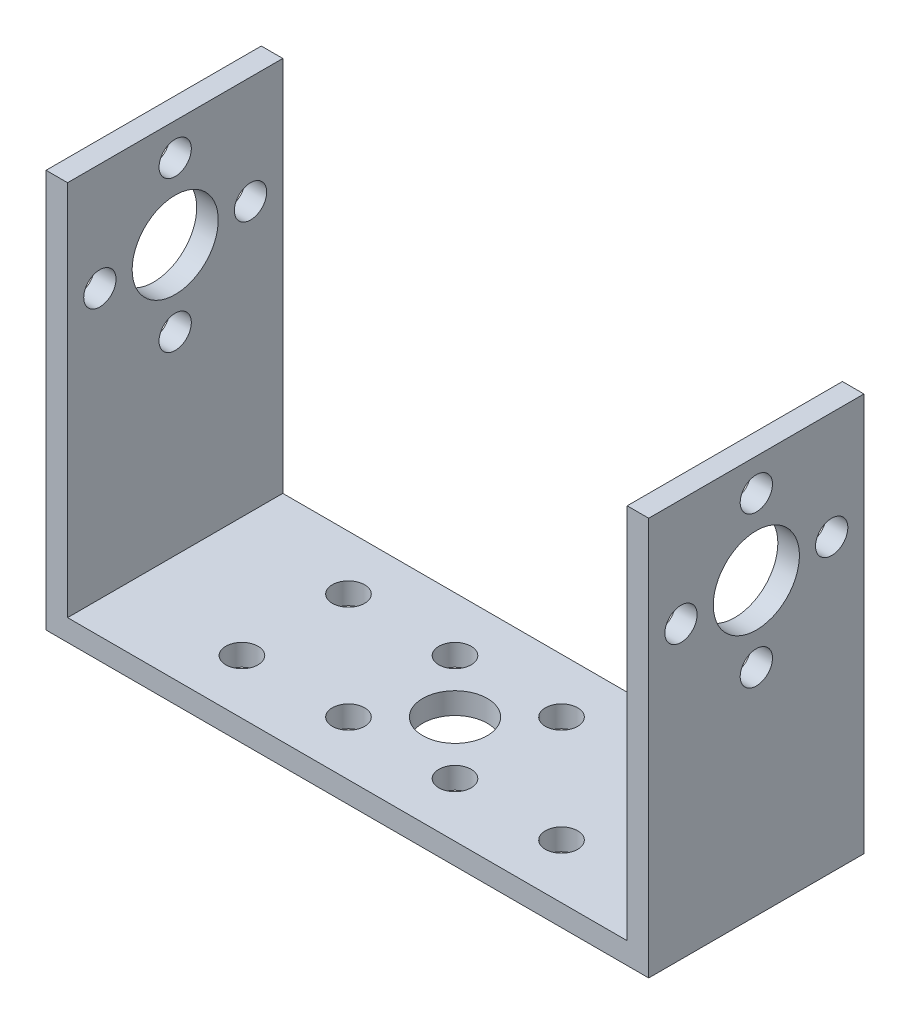
ISO-10303-21;
HEADER;
FILE_DESCRIPTION(('STEP AP214'),'2;1');
FILE_NAME('part.step','',(''),(''),'','','');
FILE_SCHEMA(('AUTOMOTIVE_DESIGN { 1 0 10303 214 1 1 1 1 }'));
ENDSEC;
DATA;
#1=APPLICATION_CONTEXT('core data for automotive mechanical design processes');
#2=APPLICATION_PROTOCOL_DEFINITION('international standard','automotive_design',2000,#1);
#3=PRODUCT_CONTEXT('',#1,'mechanical');
#4=PRODUCT('Part','Part','',(#3));
#5=PRODUCT_RELATED_PRODUCT_CATEGORY('part','',(#4));
#6=PRODUCT_DEFINITION_FORMATION('','',#4);
#7=PRODUCT_DEFINITION_CONTEXT('part definition',#1,'design');
#8=PRODUCT_DEFINITION('design','',#6,#7);
#9=PRODUCT_DEFINITION_SHAPE('','',#8);
#10=(LENGTH_UNIT() NAMED_UNIT(*) SI_UNIT(.MILLI.,.METRE.));
#11=(NAMED_UNIT(*) PLANE_ANGLE_UNIT() SI_UNIT($,.RADIAN.));
#12=(NAMED_UNIT(*) SI_UNIT($,.STERADIAN.) SOLID_ANGLE_UNIT());
#13=UNCERTAINTY_MEASURE_WITH_UNIT(LENGTH_MEASURE(1.E-05),#10,'distance_accuracy_value','');
#14=(GEOMETRIC_REPRESENTATION_CONTEXT(3) GLOBAL_UNCERTAINTY_ASSIGNED_CONTEXT((#13)) GLOBAL_UNIT_ASSIGNED_CONTEXT((#10,
#11,#12)) REPRESENTATION_CONTEXT('',''));
#15=CARTESIAN_POINT('',(0.,0.,0.));
#16=DIRECTION('',(0.,0.,1.));
#17=DIRECTION('',(1.,0.,0.));
#18=AXIS2_PLACEMENT_3D('',#15,#16,#17);
#19=CARTESIAN_POINT('',(0.,2.,0.));
#20=DIRECTION('',(0.,-1.,0.));
#21=DIRECTION('',(0.,0.,-1.));
#22=AXIS2_PLACEMENT_3D('',#19,#20,#21);
#23=PLANE('',#22);
#24=CARTESIAN_POINT('',(25.8759689922481,2.,-8.95348837209302));
#25=DIRECTION('',(0.,1.,0.));
#26=DIRECTION('',(0.,0.,1.));
#27=AXIS2_PLACEMENT_3D('',#24,#25,#26);
#28=CIRCLE('',#27,3.);
#29=CARTESIAN_POINT('',(25.8759689922481,2.,-5.95348837209302));
#30=VERTEX_POINT('',#29);
#31=EDGE_CURVE('E242',#30,#30,#28,.T.);
#32=ORIENTED_EDGE('',*,*,#31,.F.);
#33=EDGE_LOOP('',(#32));
#34=FACE_BOUND('',#33,.T.);
#35=CARTESIAN_POINT('',(20.9264689922481,2.,-13.902988372093));
#36=DIRECTION('',(0.,1.,0.));
#37=DIRECTION('',(0.,0.,1.));
#38=AXIS2_PLACEMENT_3D('',#35,#36,#37);
#39=CIRCLE('',#38,1.5);
#40=CARTESIAN_POINT('',(20.9264689922481,2.,-12.402988372093));
#41=VERTEX_POINT('',#40);
#42=EDGE_CURVE('E249',#41,#41,#39,.T.);
#43=ORIENTED_EDGE('',*,*,#42,.F.);
#44=EDGE_LOOP('',(#43));
#45=FACE_BOUND('',#44,.T.);
#46=CARTESIAN_POINT('',(30.8254689922481,2.,-13.902988372093));
#47=DIRECTION('',(0.,1.,0.));
#48=DIRECTION('',(0.,0.,1.));
#49=AXIS2_PLACEMENT_3D('',#46,#47,#48);
#50=CIRCLE('',#49,1.50000000000001);
#51=CARTESIAN_POINT('',(30.8254689922481,2.,-12.402988372093));
#52=VERTEX_POINT('',#51);
#53=EDGE_CURVE('E230',#52,#52,#50,.T.);
#54=ORIENTED_EDGE('',*,*,#53,.F.);
#55=EDGE_LOOP('',(#54));
#56=FACE_BOUND('',#55,.T.);
#57=CARTESIAN_POINT('',(20.9264689922481,2.,-4.00398837209302));
#58=DIRECTION('',(0.,1.,0.));
#59=DIRECTION('',(0.,0.,1.));
#60=AXIS2_PLACEMENT_3D('',#57,#58,#59);
#61=CIRCLE('',#60,1.5);
#62=CARTESIAN_POINT('',(20.9264689922481,2.,-2.50398837209302));
#63=VERTEX_POINT('',#62);
#64=EDGE_CURVE('E237',#63,#63,#61,.T.);
#65=ORIENTED_EDGE('',*,*,#64,.F.);
#66=EDGE_LOOP('',(#65));
#67=FACE_BOUND('',#66,.T.);
#68=CARTESIAN_POINT('',(40.7244689922481,2.,-4.00398837209302));
#69=DIRECTION('',(0.,1.,0.));
#70=DIRECTION('',(0.,0.,1.));
#71=AXIS2_PLACEMENT_3D('',#68,#69,#70);
#72=CIRCLE('',#71,1.5);
#73=CARTESIAN_POINT('',(40.7244689922481,2.,-2.50398837209302));
#74=VERTEX_POINT('',#73);
#75=EDGE_CURVE('E272',#74,#74,#72,.T.);
#76=ORIENTED_EDGE('',*,*,#75,.F.);
#77=EDGE_LOOP('',(#76));
#78=FACE_BOUND('',#77,.T.);
#79=CARTESIAN_POINT('',(40.7244689922481,2.,-13.902988372093));
#80=DIRECTION('',(0.,1.,0.));
#81=DIRECTION('',(0.,0.,1.));
#82=AXIS2_PLACEMENT_3D('',#79,#80,#81);
#83=CIRCLE('',#82,1.5);
#84=CARTESIAN_POINT('',(40.7244689922481,2.,-12.402988372093));
#85=VERTEX_POINT('',#84);
#86=EDGE_CURVE('E266',#85,#85,#83,.T.);
#87=ORIENTED_EDGE('',*,*,#86,.F.);
#88=EDGE_LOOP('',(#87));
#89=FACE_BOUND('',#88,.T.);
#90=CARTESIAN_POINT('',(11.0274689922481,2.,-13.902988372093));
#91=DIRECTION('',(0.,1.,0.));
#92=DIRECTION('',(0.,0.,1.));
#93=AXIS2_PLACEMENT_3D('',#90,#91,#92);
#94=CIRCLE('',#93,1.5);
#95=CARTESIAN_POINT('',(11.0274689922481,2.,-12.402988372093));
#96=VERTEX_POINT('',#95);
#97=EDGE_CURVE('E260',#96,#96,#94,.T.);
#98=ORIENTED_EDGE('',*,*,#97,.F.);
#99=EDGE_LOOP('',(#98));
#100=FACE_BOUND('',#99,.T.);
#101=CARTESIAN_POINT('',(11.0274689922481,2.,-4.00398837209302));
#102=DIRECTION('',(0.,1.,0.));
#103=DIRECTION('',(0.,0.,1.));
#104=AXIS2_PLACEMENT_3D('',#101,#102,#103);
#105=CIRCLE('',#104,1.5);
#106=CARTESIAN_POINT('',(11.0274689922481,2.,-2.50398837209302));
#107=VERTEX_POINT('',#106);
#108=EDGE_CURVE('E254',#107,#107,#105,.T.);
#109=ORIENTED_EDGE('',*,*,#108,.F.);
#110=EDGE_LOOP('',(#109));
#111=FACE_BOUND('',#110,.T.);
#112=CARTESIAN_POINT('',(30.8254689922481,2.,-4.00398837209302));
#113=DIRECTION('',(0.,1.,0.));
#114=DIRECTION('',(0.,0.,1.));
#115=AXIS2_PLACEMENT_3D('',#112,#113,#114);
#116=CIRCLE('',#115,1.50000000000001);
#117=CARTESIAN_POINT('',(30.8254689922481,2.,-2.50398837209302));
#118=VERTEX_POINT('',#117);
#119=EDGE_CURVE('E224',#118,#118,#116,.T.);
#120=ORIENTED_EDGE('',*,*,#119,.F.);
#121=EDGE_LOOP('',(#120));
#122=FACE_BOUND('',#121,.T.);
#123=DIRECTION('',(0.,0.,1.));
#124=VECTOR('',#123,1.);
#125=CARTESIAN_POINT('',(51.8759689922481,2.,-18.953488372093));
#126=LINE('',#125,#124);
#127=CARTESIAN_POINT('',(51.8759689922481,2.,-18.953488372093));
#128=VERTEX_POINT('',#127);
#129=CARTESIAN_POINT('',(51.8759689922481,2.,1.04651162790698));
#130=VERTEX_POINT('',#129);
#131=EDGE_CURVE('E123',#128,#130,#126,.T.);
#132=ORIENTED_EDGE('',*,*,#131,.F.);
#133=DIRECTION('',(-1.,0.,0.));
#134=VECTOR('',#133,1.);
#135=CARTESIAN_POINT('',(-2.12403100775194,2.,-18.953488372093));
#136=LINE('',#135,#134);
#137=CARTESIAN_POINT('',(-0.124031007751939,2.,-18.953488372093));
#138=VERTEX_POINT('',#137);
#139=EDGE_CURVE('E155',#128,#138,#136,.T.);
#140=ORIENTED_EDGE('',*,*,#139,.T.);
#141=DIRECTION('',(0.,0.,-1.));
#142=VECTOR('',#141,1.);
#143=CARTESIAN_POINT('',(-0.124031007751939,2.,-18.953488372093));
#144=LINE('',#143,#142);
#145=CARTESIAN_POINT('',(-0.124031007751937,2.,1.04651162790698));
#146=VERTEX_POINT('',#145);
#147=EDGE_CURVE('E54',#146,#138,#144,.T.);
#148=ORIENTED_EDGE('',*,*,#147,.F.);
#149=DIRECTION('',(1.,0.,0.));
#150=VECTOR('',#149,1.);
#151=CARTESIAN_POINT('',(-2.12403100775194,2.,1.04651162790698));
#152=LINE('',#151,#150);
#153=EDGE_CURVE('E49',#146,#130,#152,.T.);
#154=ORIENTED_EDGE('',*,*,#153,.T.);
#155=EDGE_LOOP('',(#132,#140,#148,#154));
#156=FACE_BOUND('',#155,.T.);
#157=ADVANCED_FACE('F32',(#34,#45,#56,#67,#78,#89,#100,#111,#122,#156),#23,.F.);
#158=CARTESIAN_POINT('',(-2.12403100775194,2.,1.04651162790698));
#159=DIRECTION('',(1.,0.,0.));
#160=DIRECTION('',(0.,0.,-1.));
#161=AXIS2_PLACEMENT_3D('',#158,#159,#160);
#162=PLANE('',#161);
#163=CARTESIAN_POINT('',(-2.12403100775194,27.,-15.953488372093));
#164=DIRECTION('',(-1.,0.,0.));
#165=DIRECTION('',(0.,0.,1.));
#166=AXIS2_PLACEMENT_3D('',#163,#164,#165);
#167=CIRCLE('',#166,1.5);
#168=CARTESIAN_POINT('',(-2.12403100775194,27.,-14.453488372093));
#169=VERTEX_POINT('',#168);
#170=EDGE_CURVE('E207',#169,#169,#167,.T.);
#171=ORIENTED_EDGE('',*,*,#170,.F.);
#172=EDGE_LOOP('',(#171));
#173=FACE_BOUND('',#172,.T.);
#174=CARTESIAN_POINT('',(-2.12403100775194,27.,-1.95348837209302));
#175=DIRECTION('',(-1.,0.,0.));
#176=DIRECTION('',(0.,0.,1.));
#177=AXIS2_PLACEMENT_3D('',#174,#175,#176);
#178=CIRCLE('',#177,1.5);
#179=CARTESIAN_POINT('',(-2.12403100775194,27.,-0.453488372093023));
#180=VERTEX_POINT('',#179);
#181=EDGE_CURVE('E200',#180,#180,#178,.T.);
#182=ORIENTED_EDGE('',*,*,#181,.F.);
#183=EDGE_LOOP('',(#182));
#184=FACE_BOUND('',#183,.T.);
#185=CARTESIAN_POINT('',(-2.12403100775194,34.,-8.95348837209302));
#186=DIRECTION('',(-1.,0.,0.));
#187=DIRECTION('',(0.,0.,1.));
#188=AXIS2_PLACEMENT_3D('',#185,#186,#187);
#189=CIRCLE('',#188,1.5);
#190=CARTESIAN_POINT('',(-2.12403100775194,34.,-7.45348837209302));
#191=VERTEX_POINT('',#190);
#192=EDGE_CURVE('E219',#191,#191,#189,.T.);
#193=ORIENTED_EDGE('',*,*,#192,.F.);
#194=EDGE_LOOP('',(#193));
#195=FACE_BOUND('',#194,.T.);
#196=CARTESIAN_POINT('',(-2.12403100775194,20.,-8.95348837209302));
#197=DIRECTION('',(-1.,0.,0.));
#198=DIRECTION('',(0.,0.,1.));
#199=AXIS2_PLACEMENT_3D('',#196,#197,#198);
#200=CIRCLE('',#199,1.5);
#201=CARTESIAN_POINT('',(-2.12403100775194,20.,-7.45348837209302));
#202=VERTEX_POINT('',#201);
#203=EDGE_CURVE('E212',#202,#202,#200,.T.);
#204=ORIENTED_EDGE('',*,*,#203,.F.);
#205=EDGE_LOOP('',(#204));
#206=FACE_BOUND('',#205,.T.);
#207=CARTESIAN_POINT('',(-2.12403100775194,27.,-8.95348837209302));
#208=DIRECTION('',(-1.,0.,0.));
#209=DIRECTION('',(0.,0.,1.));
#210=AXIS2_PLACEMENT_3D('',#207,#208,#209);
#211=CIRCLE('',#210,4.);
#212=CARTESIAN_POINT('',(-2.12403100775194,27.,-4.95348837209302));
#213=VERTEX_POINT('',#212);
#214=EDGE_CURVE('E194',#213,#213,#211,.T.);
#215=ORIENTED_EDGE('',*,*,#214,.F.);
#216=EDGE_LOOP('',(#215));
#217=FACE_BOUND('',#216,.T.);
#218=DIRECTION('',(0.,0.,1.));
#219=VECTOR('',#218,1.);
#220=CARTESIAN_POINT('',(-2.12403100775194,0.,1.04651162790698));
#221=LINE('',#220,#219);
#222=CARTESIAN_POINT('',(-2.12403100775194,0.,-18.953488372093));
#223=VERTEX_POINT('',#222);
#224=CARTESIAN_POINT('',(-2.12403100775194,0.,1.04651162790698));
#225=VERTEX_POINT('',#224);
#226=EDGE_CURVE('E153',#223,#225,#221,.T.);
#227=ORIENTED_EDGE('',*,*,#226,.T.);
#228=DIRECTION('',(0.,-1.,0.));
#229=VECTOR('',#228,1.);
#230=CARTESIAN_POINT('',(-2.12403100775194,2.,1.04651162790698));
#231=LINE('',#230,#229);
#232=CARTESIAN_POINT('',(-2.12403100775194,37.,1.04651162790698));
#233=VERTEX_POINT('',#232);
#234=EDGE_CURVE('E11',#233,#225,#231,.T.);
#235=ORIENTED_EDGE('',*,*,#234,.F.);
#236=DIRECTION('',(0.,0.,1.));
#237=VECTOR('',#236,1.);
#238=CARTESIAN_POINT('',(-2.12403100775194,37.,-18.953488372093));
#239=LINE('',#238,#237);
#240=CARTESIAN_POINT('',(-2.12403100775194,37.,-18.953488372093));
#241=VERTEX_POINT('',#240);
#242=EDGE_CURVE('E136',#241,#233,#239,.T.);
#243=ORIENTED_EDGE('',*,*,#242,.F.);
#244=DIRECTION('',(0.,-1.,0.));
#245=VECTOR('',#244,1.);
#246=CARTESIAN_POINT('',(-2.12403100775194,2.,-18.953488372093));
#247=LINE('',#246,#245);
#248=EDGE_CURVE('E108',#241,#223,#247,.T.);
#249=ORIENTED_EDGE('',*,*,#248,.T.);
#250=EDGE_LOOP('',(#227,#235,#243,#249));
#251=FACE_BOUND('',#250,.T.);
#252=ADVANCED_FACE('F34',(#173,#184,#195,#206,#217,#251),#162,.F.);
#253=CARTESIAN_POINT('',(-2.12403100775194,2.,1.04651162790698));
#254=DIRECTION('',(0.,0.,-1.));
#255=DIRECTION('',(-1.,0.,0.));
#256=AXIS2_PLACEMENT_3D('',#253,#254,#255);
#257=PLANE('',#256);
#258=DIRECTION('',(1.,0.,0.));
#259=VECTOR('',#258,1.);
#260=CARTESIAN_POINT('',(-2.12403100775194,0.,1.04651162790698));
#261=LINE('',#260,#259);
#262=CARTESIAN_POINT('',(53.8759689922481,0.,1.04651162790698));
#263=VERTEX_POINT('',#262);
#264=EDGE_CURVE('E160',#225,#263,#261,.T.);
#265=ORIENTED_EDGE('',*,*,#264,.T.);
#266=DIRECTION('',(0.,-1.,0.));
#267=VECTOR('',#266,1.);
#268=CARTESIAN_POINT('',(53.8759689922481,2.,1.04651162790698));
#269=LINE('',#268,#267);
#270=CARTESIAN_POINT('',(53.8759689922481,37.,1.04651162790698));
#271=VERTEX_POINT('',#270);
#272=EDGE_CURVE('E41',#271,#263,#269,.T.);
#273=ORIENTED_EDGE('',*,*,#272,.F.);
#274=DIRECTION('',(1.,0.,0.));
#275=VECTOR('',#274,1.);
#276=CARTESIAN_POINT('',(53.8759689922481,37.,1.04651162790698));
#277=LINE('',#276,#275);
#278=CARTESIAN_POINT('',(51.8759689922481,37.,1.04651162790698));
#279=VERTEX_POINT('',#278);
#280=EDGE_CURVE('E122',#279,#271,#277,.T.);
#281=ORIENTED_EDGE('',*,*,#280,.F.);
#282=DIRECTION('',(0.,-1.,0.));
#283=VECTOR('',#282,1.);
#284=CARTESIAN_POINT('',(51.8759689922481,37.,1.04651162790698));
#285=LINE('',#284,#283);
#286=EDGE_CURVE('E131',#279,#130,#285,.T.);
#287=ORIENTED_EDGE('',*,*,#286,.T.);
#288=ORIENTED_EDGE('',*,*,#153,.F.);
#289=DIRECTION('',(0.,-1.,0.));
#290=VECTOR('',#289,1.);
#291=CARTESIAN_POINT('',(-0.124031007751936,37.,1.04651162790698));
#292=LINE('',#291,#290);
#293=CARTESIAN_POINT('',(-0.124031007751936,37.,1.04651162790698));
#294=VERTEX_POINT('',#293);
#295=EDGE_CURVE('E150',#294,#146,#292,.T.);
#296=ORIENTED_EDGE('',*,*,#295,.F.);
#297=DIRECTION('',(1.,0.,0.));
#298=VECTOR('',#297,1.);
#299=CARTESIAN_POINT('',(-2.12403100775194,37.,1.04651162790698));
#300=LINE('',#299,#298);
#301=EDGE_CURVE('E139',#233,#294,#300,.T.);
#302=ORIENTED_EDGE('',*,*,#301,.F.);
#303=ORIENTED_EDGE('',*,*,#234,.T.);
#304=EDGE_LOOP('',(#265,#273,#281,#287,#288,#296,#302,#303));
#305=FACE_BOUND('',#304,.T.);
#306=ADVANCED_FACE('F304',(#305),#257,.F.);
#307=CARTESIAN_POINT('',(53.8759689922481,2.,1.04651162790698));
#308=DIRECTION('',(-1.,0.,0.));
#309=DIRECTION('',(0.,0.,1.));
#310=AXIS2_PLACEMENT_3D('',#307,#308,#309);
#311=PLANE('',#310);
#312=CARTESIAN_POINT('',(53.8759689922481,27.,-15.953488372093));
#313=DIRECTION('',(-1.,0.,0.));
#314=DIRECTION('',(0.,0.,1.));
#315=AXIS2_PLACEMENT_3D('',#312,#313,#314);
#316=CIRCLE('',#315,1.5);
#317=CARTESIAN_POINT('',(53.8759689922481,27.,-14.453488372093));
#318=VERTEX_POINT('',#317);
#319=EDGE_CURVE('E197',#318,#318,#316,.T.);
#320=ORIENTED_EDGE('',*,*,#319,.T.);
#321=EDGE_LOOP('',(#320));
#322=FACE_BOUND('',#321,.T.);
#323=CARTESIAN_POINT('',(53.8759689922481,27.,-1.95348837209302));
#324=DIRECTION('',(-1.,0.,0.));
#325=DIRECTION('',(0.,0.,1.));
#326=AXIS2_PLACEMENT_3D('',#323,#324,#325);
#327=CIRCLE('',#326,1.5);
#328=CARTESIAN_POINT('',(53.8759689922481,27.,-0.453488372093023));
#329=VERTEX_POINT('',#328);
#330=EDGE_CURVE('E203',#329,#329,#327,.T.);
#331=ORIENTED_EDGE('',*,*,#330,.T.);
#332=EDGE_LOOP('',(#331));
#333=FACE_BOUND('',#332,.T.);
#334=CARTESIAN_POINT('',(53.8759689922481,34.,-8.95348837209302));
#335=DIRECTION('',(-1.,0.,0.));
#336=DIRECTION('',(0.,0.,1.));
#337=AXIS2_PLACEMENT_3D('',#334,#335,#336);
#338=CIRCLE('',#337,1.5);
#339=CARTESIAN_POINT('',(53.8759689922481,34.,-7.45348837209302));
#340=VERTEX_POINT('',#339);
#341=EDGE_CURVE('E204',#340,#340,#338,.T.);
#342=ORIENTED_EDGE('',*,*,#341,.T.);
#343=EDGE_LOOP('',(#342));
#344=FACE_BOUND('',#343,.T.);
#345=CARTESIAN_POINT('',(53.8759689922481,20.,-8.95348837209302));
#346=DIRECTION('',(-1.,0.,0.));
#347=DIRECTION('',(0.,0.,1.));
#348=AXIS2_PLACEMENT_3D('',#345,#346,#347);
#349=CIRCLE('',#348,1.5);
#350=CARTESIAN_POINT('',(53.8759689922481,20.,-7.45348837209302));
#351=VERTEX_POINT('',#350);
#352=EDGE_CURVE('E215',#351,#351,#349,.T.);
#353=ORIENTED_EDGE('',*,*,#352,.T.);
#354=EDGE_LOOP('',(#353));
#355=FACE_BOUND('',#354,.T.);
#356=CARTESIAN_POINT('',(53.8759689922481,27.,-8.95348837209302));
#357=DIRECTION('',(-1.,0.,0.));
#358=DIRECTION('',(0.,0.,1.));
#359=AXIS2_PLACEMENT_3D('',#356,#357,#358);
#360=CIRCLE('',#359,4.);
#361=CARTESIAN_POINT('',(53.8759689922481,27.,-4.95348837209302));
#362=VERTEX_POINT('',#361);
#363=EDGE_CURVE('E171',#362,#362,#360,.T.);
#364=ORIENTED_EDGE('',*,*,#363,.T.);
#365=EDGE_LOOP('',(#364));
#366=FACE_BOUND('',#365,.T.);
#367=DIRECTION('',(0.,0.,-1.));
#368=VECTOR('',#367,1.);
#369=CARTESIAN_POINT('',(53.8759689922481,0.,1.04651162790698));
#370=LINE('',#369,#368);
#371=CARTESIAN_POINT('',(53.8759689922481,0.,-18.953488372093));
#372=VERTEX_POINT('',#371);
#373=EDGE_CURVE('E105',#263,#372,#370,.T.);
#374=ORIENTED_EDGE('',*,*,#373,.T.);
#375=DIRECTION('',(0.,-1.,0.));
#376=VECTOR('',#375,1.);
#377=CARTESIAN_POINT('',(53.8759689922481,2.,-18.953488372093));
#378=LINE('',#377,#376);
#379=CARTESIAN_POINT('',(53.8759689922481,37.,-18.953488372093));
#380=VERTEX_POINT('',#379);
#381=EDGE_CURVE('E98',#380,#372,#378,.T.);
#382=ORIENTED_EDGE('',*,*,#381,.F.);
#383=DIRECTION('',(0.,0.,-1.));
#384=VECTOR('',#383,1.);
#385=CARTESIAN_POINT('',(53.8759689922481,37.,-18.953488372093));
#386=LINE('',#385,#384);
#387=EDGE_CURVE('E103',#271,#380,#386,.T.);
#388=ORIENTED_EDGE('',*,*,#387,.F.);
#389=ORIENTED_EDGE('',*,*,#272,.T.);
#390=EDGE_LOOP('',(#374,#382,#388,#389));
#391=FACE_BOUND('',#390,.T.);
#392=ADVANCED_FACE('F100',(#322,#333,#344,#355,#366,#391),#311,.F.);
#393=CARTESIAN_POINT('',(-2.12403100775194,2.,-18.953488372093));
#394=DIRECTION('',(0.,0.,1.));
#395=DIRECTION('',(1.,0.,0.));
#396=AXIS2_PLACEMENT_3D('',#393,#394,#395);
#397=PLANE('',#396);
#398=DIRECTION('',(-1.,0.,0.));
#399=VECTOR('',#398,1.);
#400=CARTESIAN_POINT('',(-2.12403100775194,0.,-18.953488372093));
#401=LINE('',#400,#399);
#402=EDGE_CURVE('E156',#372,#223,#401,.T.);
#403=ORIENTED_EDGE('',*,*,#402,.T.);
#404=ORIENTED_EDGE('',*,*,#248,.F.);
#405=DIRECTION('',(-1.,0.,0.));
#406=VECTOR('',#405,1.);
#407=CARTESIAN_POINT('',(-2.12403100775194,37.,-18.953488372093));
#408=LINE('',#407,#406);
#409=CARTESIAN_POINT('',(-0.124031007751939,37.,-18.953488372093));
#410=VERTEX_POINT('',#409);
#411=EDGE_CURVE('E143',#410,#241,#408,.T.);
#412=ORIENTED_EDGE('',*,*,#411,.F.);
#413=DIRECTION('',(0.,-1.,0.));
#414=VECTOR('',#413,1.);
#415=CARTESIAN_POINT('',(-0.124031007751939,37.,-18.953488372093));
#416=LINE('',#415,#414);
#417=EDGE_CURVE('E146',#410,#138,#416,.T.);
#418=ORIENTED_EDGE('',*,*,#417,.T.);
#419=ORIENTED_EDGE('',*,*,#139,.F.);
#420=DIRECTION('',(0.,-1.,0.));
#421=VECTOR('',#420,1.);
#422=CARTESIAN_POINT('',(51.8759689922481,37.,-18.953488372093));
#423=LINE('',#422,#421);
#424=CARTESIAN_POINT('',(51.8759689922481,37.,-18.953488372093));
#425=VERTEX_POINT('',#424);
#426=EDGE_CURVE('E114',#425,#128,#423,.T.);
#427=ORIENTED_EDGE('',*,*,#426,.F.);
#428=DIRECTION('',(-1.,0.,0.));
#429=VECTOR('',#428,1.);
#430=CARTESIAN_POINT('',(53.8759689922481,37.,-18.953488372093));
#431=LINE('',#430,#429);
#432=EDGE_CURVE('E111',#380,#425,#431,.T.);
#433=ORIENTED_EDGE('',*,*,#432,.F.);
#434=ORIENTED_EDGE('',*,*,#381,.T.);
#435=EDGE_LOOP('',(#403,#404,#412,#418,#419,#427,#433,#434));
#436=FACE_BOUND('',#435,.T.);
#437=ADVANCED_FACE('F112',(#436),#397,.F.);
#438=CARTESIAN_POINT('',(0.,0.,0.));
#439=DIRECTION('',(0.,-1.,0.));
#440=DIRECTION('',(0.,0.,-1.));
#441=AXIS2_PLACEMENT_3D('',#438,#439,#440);
#442=PLANE('',#441);
#443=CARTESIAN_POINT('',(25.8759689922481,0.,-8.95348837209302));
#444=DIRECTION('',(0.,1.,0.));
#445=DIRECTION('',(0.,0.,1.));
#446=AXIS2_PLACEMENT_3D('',#443,#444,#445);
#447=CIRCLE('',#446,3.);
#448=CARTESIAN_POINT('',(25.8759689922481,0.,-5.95348837209302));
#449=VERTEX_POINT('',#448);
#450=EDGE_CURVE('E245',#449,#449,#447,.T.);
#451=ORIENTED_EDGE('',*,*,#450,.T.);
#452=EDGE_LOOP('',(#451));
#453=FACE_BOUND('',#452,.T.);
#454=CARTESIAN_POINT('',(20.9264689922481,0.,-13.902988372093));
#455=DIRECTION('',(0.,1.,0.));
#456=DIRECTION('',(0.,0.,1.));
#457=AXIS2_PLACEMENT_3D('',#454,#455,#456);
#458=CIRCLE('',#457,1.5);
#459=CARTESIAN_POINT('',(20.9264689922481,0.,-12.402988372093));
#460=VERTEX_POINT('',#459);
#461=EDGE_CURVE('E234',#460,#460,#458,.T.);
#462=ORIENTED_EDGE('',*,*,#461,.T.);
#463=EDGE_LOOP('',(#462));
#464=FACE_BOUND('',#463,.T.);
#465=CARTESIAN_POINT('',(30.8254689922481,0.,-13.902988372093));
#466=DIRECTION('',(0.,1.,0.));
#467=DIRECTION('',(0.,0.,1.));
#468=AXIS2_PLACEMENT_3D('',#465,#466,#467);
#469=CIRCLE('',#468,1.50000000000001);
#470=CARTESIAN_POINT('',(30.8254689922481,0.,-12.402988372093));
#471=VERTEX_POINT('',#470);
#472=EDGE_CURVE('E233',#471,#471,#469,.T.);
#473=ORIENTED_EDGE('',*,*,#472,.T.);
#474=EDGE_LOOP('',(#473));
#475=FACE_BOUND('',#474,.T.);
#476=CARTESIAN_POINT('',(20.9264689922481,0.,-4.00398837209302));
#477=DIRECTION('',(0.,1.,0.));
#478=DIRECTION('',(0.,0.,1.));
#479=AXIS2_PLACEMENT_3D('',#476,#477,#478);
#480=CIRCLE('',#479,1.5);
#481=CARTESIAN_POINT('',(20.9264689922481,0.,-2.50398837209302));
#482=VERTEX_POINT('',#481);
#483=EDGE_CURVE('E227',#482,#482,#480,.T.);
#484=ORIENTED_EDGE('',*,*,#483,.T.);
#485=EDGE_LOOP('',(#484));
#486=FACE_BOUND('',#485,.T.);
#487=CARTESIAN_POINT('',(40.7244689922481,0.,-4.00398837209302));
#488=DIRECTION('',(0.,1.,0.));
#489=DIRECTION('',(0.,0.,1.));
#490=AXIS2_PLACEMENT_3D('',#487,#488,#489);
#491=CIRCLE('',#490,1.5);
#492=CARTESIAN_POINT('',(40.7244689922481,0.,-2.50398837209302));
#493=VERTEX_POINT('',#492);
#494=EDGE_CURVE('E246',#493,#493,#491,.T.);
#495=ORIENTED_EDGE('',*,*,#494,.T.);
#496=EDGE_LOOP('',(#495));
#497=FACE_BOUND('',#496,.T.);
#498=CARTESIAN_POINT('',(40.7244689922481,0.,-13.902988372093));
#499=DIRECTION('',(0.,1.,0.));
#500=DIRECTION('',(0.,0.,1.));
#501=AXIS2_PLACEMENT_3D('',#498,#499,#500);
#502=CIRCLE('',#501,1.5);
#503=CARTESIAN_POINT('',(40.7244689922481,0.,-12.402988372093));
#504=VERTEX_POINT('',#503);
#505=EDGE_CURVE('E269',#504,#504,#502,.T.);
#506=ORIENTED_EDGE('',*,*,#505,.T.);
#507=EDGE_LOOP('',(#506));
#508=FACE_BOUND('',#507,.T.);
#509=CARTESIAN_POINT('',(11.0274689922481,0.,-13.902988372093));
#510=DIRECTION('',(0.,1.,0.));
#511=DIRECTION('',(0.,0.,1.));
#512=AXIS2_PLACEMENT_3D('',#509,#510,#511);
#513=CIRCLE('',#512,1.5);
#514=CARTESIAN_POINT('',(11.0274689922481,0.,-12.402988372093));
#515=VERTEX_POINT('',#514);
#516=EDGE_CURVE('E263',#515,#515,#513,.T.);
#517=ORIENTED_EDGE('',*,*,#516,.T.);
#518=EDGE_LOOP('',(#517));
#519=FACE_BOUND('',#518,.T.);
#520=CARTESIAN_POINT('',(11.0274689922481,0.,-4.00398837209302));
#521=DIRECTION('',(0.,1.,0.));
#522=DIRECTION('',(0.,0.,1.));
#523=AXIS2_PLACEMENT_3D('',#520,#521,#522);
#524=CIRCLE('',#523,1.5);
#525=CARTESIAN_POINT('',(11.0274689922481,0.,-2.50398837209302));
#526=VERTEX_POINT('',#525);
#527=EDGE_CURVE('E257',#526,#526,#524,.T.);
#528=ORIENTED_EDGE('',*,*,#527,.T.);
#529=EDGE_LOOP('',(#528));
#530=FACE_BOUND('',#529,.T.);
#531=CARTESIAN_POINT('',(30.8254689922481,0.,-4.00398837209302));
#532=DIRECTION('',(0.,1.,0.));
#533=DIRECTION('',(0.,0.,1.));
#534=AXIS2_PLACEMENT_3D('',#531,#532,#533);
#535=CIRCLE('',#534,1.50000000000001);
#536=CARTESIAN_POINT('',(30.8254689922481,0.,-2.50398837209302));
#537=VERTEX_POINT('',#536);
#538=EDGE_CURVE('E216',#537,#537,#535,.T.);
#539=ORIENTED_EDGE('',*,*,#538,.T.);
#540=EDGE_LOOP('',(#539));
#541=FACE_BOUND('',#540,.T.);
#542=ORIENTED_EDGE('',*,*,#226,.F.);
#543=ORIENTED_EDGE('',*,*,#402,.F.);
#544=ORIENTED_EDGE('',*,*,#373,.F.);
#545=ORIENTED_EDGE('',*,*,#264,.F.);
#546=EDGE_LOOP('',(#542,#543,#544,#545));
#547=FACE_BOUND('',#546,.T.);
#548=ADVANCED_FACE('F278',(#453,#464,#475,#486,#497,#508,#519,#530,#541,#547),#442,.T.);
#549=CARTESIAN_POINT('',(-0.124031007751939,37.,-18.953488372093));
#550=DIRECTION('',(-1.,0.,0.));
#551=DIRECTION('',(0.,0.,1.));
#552=AXIS2_PLACEMENT_3D('',#549,#550,#551);
#553=PLANE('',#552);
#554=CARTESIAN_POINT('',(-0.124031007751942,27.,-15.953488372093));
#555=DIRECTION('',(-1.,0.,0.));
#556=DIRECTION('',(0.,0.,1.));
#557=AXIS2_PLACEMENT_3D('',#554,#555,#556);
#558=CIRCLE('',#557,1.5);
#559=CARTESIAN_POINT('',(-0.124031007751941,27.,-14.453488372093));
#560=VERTEX_POINT('',#559);
#561=EDGE_CURVE('E125',#560,#560,#558,.T.);
#562=ORIENTED_EDGE('',*,*,#561,.T.);
#563=EDGE_LOOP('',(#562));
#564=FACE_BOUND('',#563,.T.);
#565=CARTESIAN_POINT('',(-0.124031007751942,27.,-1.95348837209302));
#566=DIRECTION('',(-1.,0.,0.));
#567=DIRECTION('',(0.,0.,1.));
#568=AXIS2_PLACEMENT_3D('',#565,#566,#567);
#569=CIRCLE('',#568,1.5);
#570=CARTESIAN_POINT('',(-0.124031007751941,27.,-0.453488372093023));
#571=VERTEX_POINT('',#570);
#572=EDGE_CURVE('E181',#571,#571,#569,.T.);
#573=ORIENTED_EDGE('',*,*,#572,.T.);
#574=EDGE_LOOP('',(#573));
#575=FACE_BOUND('',#574,.T.);
#576=CARTESIAN_POINT('',(-0.124031007751942,34.,-8.95348837209302));
#577=DIRECTION('',(-1.,0.,0.));
#578=DIRECTION('',(0.,0.,1.));
#579=AXIS2_PLACEMENT_3D('',#576,#577,#578);
#580=CIRCLE('',#579,1.5);
#581=CARTESIAN_POINT('',(-0.124031007751941,34.,-7.45348837209302));
#582=VERTEX_POINT('',#581);
#583=EDGE_CURVE('E178',#582,#582,#580,.T.);
#584=ORIENTED_EDGE('',*,*,#583,.T.);
#585=EDGE_LOOP('',(#584));
#586=FACE_BOUND('',#585,.T.);
#587=CARTESIAN_POINT('',(-0.124031007751942,20.,-8.95348837209302));
#588=DIRECTION('',(-1.,0.,0.));
#589=DIRECTION('',(0.,0.,1.));
#590=AXIS2_PLACEMENT_3D('',#587,#588,#589);
#591=CIRCLE('',#590,1.5);
#592=CARTESIAN_POINT('',(-0.124031007751941,20.,-7.45348837209302));
#593=VERTEX_POINT('',#592);
#594=EDGE_CURVE('E175',#593,#593,#591,.T.);
#595=ORIENTED_EDGE('',*,*,#594,.T.);
#596=EDGE_LOOP('',(#595));
#597=FACE_BOUND('',#596,.T.);
#598=CARTESIAN_POINT('',(-0.124031007751942,27.,-8.95348837209302));
#599=DIRECTION('',(-1.,0.,0.));
#600=DIRECTION('',(0.,0.,1.));
#601=AXIS2_PLACEMENT_3D('',#598,#599,#600);
#602=CIRCLE('',#601,4.);
#603=CARTESIAN_POINT('',(-0.124031007751941,27.,-4.95348837209302));
#604=VERTEX_POINT('',#603);
#605=EDGE_CURVE('E170',#604,#604,#602,.T.);
#606=ORIENTED_EDGE('',*,*,#605,.T.);
#607=EDGE_LOOP('',(#606));
#608=FACE_BOUND('',#607,.T.);
#609=ORIENTED_EDGE('',*,*,#147,.T.);
#610=ORIENTED_EDGE('',*,*,#417,.F.);
#611=DIRECTION('',(0.,0.,-1.));
#612=VECTOR('',#611,1.);
#613=CARTESIAN_POINT('',(-0.124031007751939,37.,-18.953488372093));
#614=LINE('',#613,#612);
#615=EDGE_CURVE('E141',#294,#410,#614,.T.);
#616=ORIENTED_EDGE('',*,*,#615,.F.);
#617=ORIENTED_EDGE('',*,*,#295,.T.);
#618=EDGE_LOOP('',(#609,#610,#616,#617));
#619=FACE_BOUND('',#618,.T.);
#620=ADVANCED_FACE('F317',(#564,#575,#586,#597,#608,#619),#553,.F.);
#621=CARTESIAN_POINT('',(0.,37.,0.));
#622=DIRECTION('',(0.,1.,0.));
#623=DIRECTION('',(0.,0.,1.));
#624=AXIS2_PLACEMENT_3D('',#621,#622,#623);
#625=PLANE('',#624);
#626=ORIENTED_EDGE('',*,*,#242,.T.);
#627=ORIENTED_EDGE('',*,*,#301,.T.);
#628=ORIENTED_EDGE('',*,*,#615,.T.);
#629=ORIENTED_EDGE('',*,*,#411,.T.);
#630=EDGE_LOOP('',(#626,#627,#628,#629));
#631=FACE_BOUND('',#630,.T.);
#632=ADVANCED_FACE('F312',(#631),#625,.T.);
#633=CARTESIAN_POINT('',(51.8759689922481,37.,-18.953488372093));
#634=DIRECTION('',(1.,0.,0.));
#635=DIRECTION('',(0.,0.,-1.));
#636=AXIS2_PLACEMENT_3D('',#633,#634,#635);
#637=PLANE('',#636);
#638=CARTESIAN_POINT('',(51.8759689922481,27.,-15.953488372093));
#639=DIRECTION('',(1.,0.,0.));
#640=DIRECTION('',(0.,0.,-1.));
#641=AXIS2_PLACEMENT_3D('',#638,#639,#640);
#642=CIRCLE('',#641,1.5);
#643=CARTESIAN_POINT('',(51.8759689922481,27.,-17.453488372093));
#644=VERTEX_POINT('',#643);
#645=EDGE_CURVE('E36',#644,#644,#642,.T.);
#646=ORIENTED_EDGE('',*,*,#645,.T.);
#647=EDGE_LOOP('',(#646));
#648=FACE_BOUND('',#647,.T.);
#649=CARTESIAN_POINT('',(51.8759689922481,27.,-1.95348837209302));
#650=DIRECTION('',(1.,0.,0.));
#651=DIRECTION('',(0.,0.,-1.));
#652=AXIS2_PLACEMENT_3D('',#649,#650,#651);
#653=CIRCLE('',#652,1.5);
#654=CARTESIAN_POINT('',(51.8759689922481,27.,-3.45348837209302));
#655=VERTEX_POINT('',#654);
#656=EDGE_CURVE('E179',#655,#655,#653,.T.);
#657=ORIENTED_EDGE('',*,*,#656,.T.);
#658=EDGE_LOOP('',(#657));
#659=FACE_BOUND('',#658,.T.);
#660=CARTESIAN_POINT('',(51.8759689922481,34.,-8.95348837209302));
#661=DIRECTION('',(1.,0.,0.));
#662=DIRECTION('',(0.,0.,-1.));
#663=AXIS2_PLACEMENT_3D('',#660,#661,#662);
#664=CIRCLE('',#663,1.5);
#665=CARTESIAN_POINT('',(51.8759689922481,34.,-10.453488372093));
#666=VERTEX_POINT('',#665);
#667=EDGE_CURVE('E176',#666,#666,#664,.T.);
#668=ORIENTED_EDGE('',*,*,#667,.T.);
#669=EDGE_LOOP('',(#668));
#670=FACE_BOUND('',#669,.T.);
#671=CARTESIAN_POINT('',(51.8759689922481,20.,-8.95348837209302));
#672=DIRECTION('',(1.,0.,0.));
#673=DIRECTION('',(0.,0.,-1.));
#674=AXIS2_PLACEMENT_3D('',#671,#672,#673);
#675=CIRCLE('',#674,1.5);
#676=CARTESIAN_POINT('',(51.8759689922481,20.,-10.453488372093));
#677=VERTEX_POINT('',#676);
#678=EDGE_CURVE('E172',#677,#677,#675,.T.);
#679=ORIENTED_EDGE('',*,*,#678,.T.);
#680=EDGE_LOOP('',(#679));
#681=FACE_BOUND('',#680,.T.);
#682=CARTESIAN_POINT('',(51.8759689922481,27.,-8.95348837209302));
#683=DIRECTION('',(1.,0.,0.));
#684=DIRECTION('',(0.,0.,-1.));
#685=AXIS2_PLACEMENT_3D('',#682,#683,#684);
#686=CIRCLE('',#685,4.);
#687=CARTESIAN_POINT('',(51.8759689922481,27.,-12.953488372093));
#688=VERTEX_POINT('',#687);
#689=EDGE_CURVE('E167',#688,#688,#686,.T.);
#690=ORIENTED_EDGE('',*,*,#689,.T.);
#691=EDGE_LOOP('',(#690));
#692=FACE_BOUND('',#691,.T.);
#693=ORIENTED_EDGE('',*,*,#131,.T.);
#694=ORIENTED_EDGE('',*,*,#286,.F.);
#695=DIRECTION('',(0.,0.,1.));
#696=VECTOR('',#695,1.);
#697=CARTESIAN_POINT('',(51.8759689922481,37.,-18.953488372093));
#698=LINE('',#697,#696);
#699=EDGE_CURVE('E117',#425,#279,#698,.T.);
#700=ORIENTED_EDGE('',*,*,#699,.F.);
#701=ORIENTED_EDGE('',*,*,#426,.T.);
#702=EDGE_LOOP('',(#693,#694,#700,#701));
#703=FACE_BOUND('',#702,.T.);
#704=ADVANCED_FACE('F302',(#648,#659,#670,#681,#692,#703),#637,.F.);
#705=CARTESIAN_POINT('',(0.,37.,0.));
#706=DIRECTION('',(0.,-1.,0.));
#707=DIRECTION('',(0.,0.,-1.));
#708=AXIS2_PLACEMENT_3D('',#705,#706,#707);
#709=PLANE('',#708);
#710=ORIENTED_EDGE('',*,*,#387,.T.);
#711=ORIENTED_EDGE('',*,*,#432,.T.);
#712=ORIENTED_EDGE('',*,*,#699,.T.);
#713=ORIENTED_EDGE('',*,*,#280,.T.);
#714=EDGE_LOOP('',(#710,#711,#712,#713));
#715=FACE_BOUND('',#714,.T.);
#716=ADVANCED_FACE('F120',(#715),#709,.F.);
#717=CARTESIAN_POINT('',(53.8759689922481,27.,-8.95348837209302));
#718=DIRECTION('',(-1.,0.,0.));
#719=DIRECTION('',(0.,0.,1.));
#720=AXIS2_PLACEMENT_3D('',#717,#718,#719);
#721=CYLINDRICAL_SURFACE('',#720,4.);
#722=ORIENTED_EDGE('',*,*,#363,.F.);
#723=EDGE_LOOP('',(#722));
#724=FACE_BOUND('',#723,.T.);
#725=ORIENTED_EDGE('',*,*,#689,.F.);
#726=EDGE_LOOP('',(#725));
#727=FACE_BOUND('',#726,.T.);
#728=ADVANCED_FACE('F359',(#724,#727),#721,.F.);
#729=CARTESIAN_POINT('',(53.8759689922481,20.,-8.95348837209302));
#730=DIRECTION('',(-1.,0.,0.));
#731=DIRECTION('',(0.,0.,1.));
#732=AXIS2_PLACEMENT_3D('',#729,#730,#731);
#733=CYLINDRICAL_SURFACE('',#732,1.5);
#734=ORIENTED_EDGE('',*,*,#352,.F.);
#735=EDGE_LOOP('',(#734));
#736=FACE_BOUND('',#735,.T.);
#737=ORIENTED_EDGE('',*,*,#678,.F.);
#738=EDGE_LOOP('',(#737));
#739=FACE_BOUND('',#738,.T.);
#740=ADVANCED_FACE('F369',(#736,#739),#733,.F.);
#741=CARTESIAN_POINT('',(53.8759689922481,34.,-8.95348837209302));
#742=DIRECTION('',(-1.,0.,0.));
#743=DIRECTION('',(0.,0.,1.));
#744=AXIS2_PLACEMENT_3D('',#741,#742,#743);
#745=CYLINDRICAL_SURFACE('',#744,1.5);
#746=ORIENTED_EDGE('',*,*,#341,.F.);
#747=EDGE_LOOP('',(#746));
#748=FACE_BOUND('',#747,.T.);
#749=ORIENTED_EDGE('',*,*,#667,.F.);
#750=EDGE_LOOP('',(#749));
#751=FACE_BOUND('',#750,.T.);
#752=ADVANCED_FACE('F382',(#748,#751),#745,.F.);
#753=CARTESIAN_POINT('',(53.8759689922481,27.,-1.95348837209302));
#754=DIRECTION('',(-1.,0.,0.));
#755=DIRECTION('',(0.,0.,1.));
#756=AXIS2_PLACEMENT_3D('',#753,#754,#755);
#757=CYLINDRICAL_SURFACE('',#756,1.5);
#758=ORIENTED_EDGE('',*,*,#330,.F.);
#759=EDGE_LOOP('',(#758));
#760=FACE_BOUND('',#759,.T.);
#761=ORIENTED_EDGE('',*,*,#656,.F.);
#762=EDGE_LOOP('',(#761));
#763=FACE_BOUND('',#762,.T.);
#764=ADVANCED_FACE('F370',(#760,#763),#757,.F.);
#765=CARTESIAN_POINT('',(53.8759689922481,27.,-15.953488372093));
#766=DIRECTION('',(-1.,0.,0.));
#767=DIRECTION('',(0.,0.,1.));
#768=AXIS2_PLACEMENT_3D('',#765,#766,#767);
#769=CYLINDRICAL_SURFACE('',#768,1.5);
#770=ORIENTED_EDGE('',*,*,#319,.F.);
#771=EDGE_LOOP('',(#770));
#772=FACE_BOUND('',#771,.T.);
#773=ORIENTED_EDGE('',*,*,#645,.F.);
#774=EDGE_LOOP('',(#773));
#775=FACE_BOUND('',#774,.T.);
#776=ADVANCED_FACE('F357',(#772,#775),#769,.F.);
#777=ORIENTED_EDGE('',*,*,#214,.T.);
#778=EDGE_LOOP('',(#777));
#779=FACE_BOUND('',#778,.T.);
#780=ORIENTED_EDGE('',*,*,#605,.F.);
#781=EDGE_LOOP('',(#780));
#782=FACE_BOUND('',#781,.T.);
#783=ADVANCED_FACE('F353',(#779,#782),#721,.F.);
#784=ORIENTED_EDGE('',*,*,#203,.T.);
#785=EDGE_LOOP('',(#784));
#786=FACE_BOUND('',#785,.T.);
#787=ORIENTED_EDGE('',*,*,#594,.F.);
#788=EDGE_LOOP('',(#787));
#789=FACE_BOUND('',#788,.T.);
#790=ADVANCED_FACE('F356',(#786,#789),#733,.F.);
#791=ORIENTED_EDGE('',*,*,#192,.T.);
#792=EDGE_LOOP('',(#791));
#793=FACE_BOUND('',#792,.T.);
#794=ORIENTED_EDGE('',*,*,#583,.F.);
#795=EDGE_LOOP('',(#794));
#796=FACE_BOUND('',#795,.T.);
#797=ADVANCED_FACE('F366',(#793,#796),#745,.F.);
#798=ORIENTED_EDGE('',*,*,#181,.T.);
#799=EDGE_LOOP('',(#798));
#800=FACE_BOUND('',#799,.T.);
#801=ORIENTED_EDGE('',*,*,#572,.F.);
#802=EDGE_LOOP('',(#801));
#803=FACE_BOUND('',#802,.T.);
#804=ADVANCED_FACE('F407',(#800,#803),#757,.F.);
#805=ORIENTED_EDGE('',*,*,#170,.T.);
#806=EDGE_LOOP('',(#805));
#807=FACE_BOUND('',#806,.T.);
#808=ORIENTED_EDGE('',*,*,#561,.F.);
#809=EDGE_LOOP('',(#808));
#810=FACE_BOUND('',#809,.T.);
#811=ADVANCED_FACE('F373',(#807,#810),#769,.F.);
#812=CARTESIAN_POINT('',(30.8254689922481,0.,-4.00398837209302));
#813=DIRECTION('',(0.,1.,0.));
#814=DIRECTION('',(0.,0.,1.));
#815=AXIS2_PLACEMENT_3D('',#812,#813,#814);
#816=CYLINDRICAL_SURFACE('',#815,1.50000000000001);
#817=ORIENTED_EDGE('',*,*,#538,.F.);
#818=EDGE_LOOP('',(#817));
#819=FACE_BOUND('',#818,.T.);
#820=ORIENTED_EDGE('',*,*,#119,.T.);
#821=EDGE_LOOP('',(#820));
#822=FACE_BOUND('',#821,.T.);
#823=ADVANCED_FACE('F420',(#819,#822),#816,.F.);
#824=CARTESIAN_POINT('',(11.0274689922481,0.,-4.00398837209302));
#825=DIRECTION('',(0.,1.,0.));
#826=DIRECTION('',(0.,0.,1.));
#827=AXIS2_PLACEMENT_3D('',#824,#825,#826);
#828=CYLINDRICAL_SURFACE('',#827,1.5);
#829=ORIENTED_EDGE('',*,*,#527,.F.);
#830=EDGE_LOOP('',(#829));
#831=FACE_BOUND('',#830,.T.);
#832=ORIENTED_EDGE('',*,*,#108,.T.);
#833=EDGE_LOOP('',(#832));
#834=FACE_BOUND('',#833,.T.);
#835=ADVANCED_FACE('F430',(#831,#834),#828,.F.);
#836=CARTESIAN_POINT('',(11.0274689922481,0.,-13.902988372093));
#837=DIRECTION('',(0.,1.,0.));
#838=DIRECTION('',(0.,0.,1.));
#839=AXIS2_PLACEMENT_3D('',#836,#837,#838);
#840=CYLINDRICAL_SURFACE('',#839,1.5);
#841=ORIENTED_EDGE('',*,*,#516,.F.);
#842=EDGE_LOOP('',(#841));
#843=FACE_BOUND('',#842,.T.);
#844=ORIENTED_EDGE('',*,*,#97,.T.);
#845=EDGE_LOOP('',(#844));
#846=FACE_BOUND('',#845,.T.);
#847=ADVANCED_FACE('F437',(#843,#846),#840,.F.);
#848=CARTESIAN_POINT('',(40.7244689922481,0.,-13.902988372093));
#849=DIRECTION('',(0.,1.,0.));
#850=DIRECTION('',(0.,0.,1.));
#851=AXIS2_PLACEMENT_3D('',#848,#849,#850);
#852=CYLINDRICAL_SURFACE('',#851,1.5);
#853=ORIENTED_EDGE('',*,*,#505,.F.);
#854=EDGE_LOOP('',(#853));
#855=FACE_BOUND('',#854,.T.);
#856=ORIENTED_EDGE('',*,*,#86,.T.);
#857=EDGE_LOOP('',(#856));
#858=FACE_BOUND('',#857,.T.);
#859=ADVANCED_FACE('F285',(#855,#858),#852,.F.);
#860=CARTESIAN_POINT('',(40.7244689922481,0.,-4.00398837209302));
#861=DIRECTION('',(0.,1.,0.));
#862=DIRECTION('',(0.,0.,1.));
#863=AXIS2_PLACEMENT_3D('',#860,#861,#862);
#864=CYLINDRICAL_SURFACE('',#863,1.5);
#865=ORIENTED_EDGE('',*,*,#494,.F.);
#866=EDGE_LOOP('',(#865));
#867=FACE_BOUND('',#866,.T.);
#868=ORIENTED_EDGE('',*,*,#75,.T.);
#869=EDGE_LOOP('',(#868));
#870=FACE_BOUND('',#869,.T.);
#871=ADVANCED_FACE('F281',(#867,#870),#864,.F.);
#872=CARTESIAN_POINT('',(20.9264689922481,0.,-4.00398837209302));
#873=DIRECTION('',(0.,1.,0.));
#874=DIRECTION('',(0.,0.,1.));
#875=AXIS2_PLACEMENT_3D('',#872,#873,#874);
#876=CYLINDRICAL_SURFACE('',#875,1.5);
#877=ORIENTED_EDGE('',*,*,#483,.F.);
#878=EDGE_LOOP('',(#877));
#879=FACE_BOUND('',#878,.T.);
#880=ORIENTED_EDGE('',*,*,#64,.T.);
#881=EDGE_LOOP('',(#880));
#882=FACE_BOUND('',#881,.T.);
#883=ADVANCED_FACE('F284',(#879,#882),#876,.F.);
#884=CARTESIAN_POINT('',(30.8254689922481,0.,-13.902988372093));
#885=DIRECTION('',(0.,1.,0.));
#886=DIRECTION('',(0.,0.,1.));
#887=AXIS2_PLACEMENT_3D('',#884,#885,#886);
#888=CYLINDRICAL_SURFACE('',#887,1.50000000000001);
#889=ORIENTED_EDGE('',*,*,#472,.F.);
#890=EDGE_LOOP('',(#889));
#891=FACE_BOUND('',#890,.T.);
#892=ORIENTED_EDGE('',*,*,#53,.T.);
#893=EDGE_LOOP('',(#892));
#894=FACE_BOUND('',#893,.T.);
#895=ADVANCED_FACE('F443',(#891,#894),#888,.F.);
#896=CARTESIAN_POINT('',(20.9264689922481,0.,-13.902988372093));
#897=DIRECTION('',(0.,1.,0.));
#898=DIRECTION('',(0.,0.,1.));
#899=AXIS2_PLACEMENT_3D('',#896,#897,#898);
#900=CYLINDRICAL_SURFACE('',#899,1.5);
#901=ORIENTED_EDGE('',*,*,#461,.F.);
#902=EDGE_LOOP('',(#901));
#903=FACE_BOUND('',#902,.T.);
#904=ORIENTED_EDGE('',*,*,#42,.T.);
#905=EDGE_LOOP('',(#904));
#906=FACE_BOUND('',#905,.T.);
#907=ADVANCED_FACE('F446',(#903,#906),#900,.F.);
#908=CARTESIAN_POINT('',(25.8759689922481,0.,-8.95348837209302));
#909=DIRECTION('',(0.,1.,0.));
#910=DIRECTION('',(0.,0.,1.));
#911=AXIS2_PLACEMENT_3D('',#908,#909,#910);
#912=CYLINDRICAL_SURFACE('',#911,3.);
#913=ORIENTED_EDGE('',*,*,#450,.F.);
#914=EDGE_LOOP('',(#913));
#915=FACE_BOUND('',#914,.T.);
#916=ORIENTED_EDGE('',*,*,#31,.T.);
#917=EDGE_LOOP('',(#916));
#918=FACE_BOUND('',#917,.T.);
#919=ADVANCED_FACE('F451',(#915,#918),#912,.F.);
#920=CLOSED_SHELL('',(#157,#252,#306,#392,#437,#548,#620,#632,#704,#716,#728,#740,#752,#764,
#776,#783,#790,#797,#804,#811,#823,#835,#847,#859,#871,#883,#895,#907,#919));
#921=MANIFOLD_SOLID_BREP('B2',#920);
#922=ADVANCED_BREP_SHAPE_REPRESENTATION('',(#18,#921),#14);
#923=SHAPE_DEFINITION_REPRESENTATION(#9,#922);
ENDSEC;
END-ISO-10303-21;
